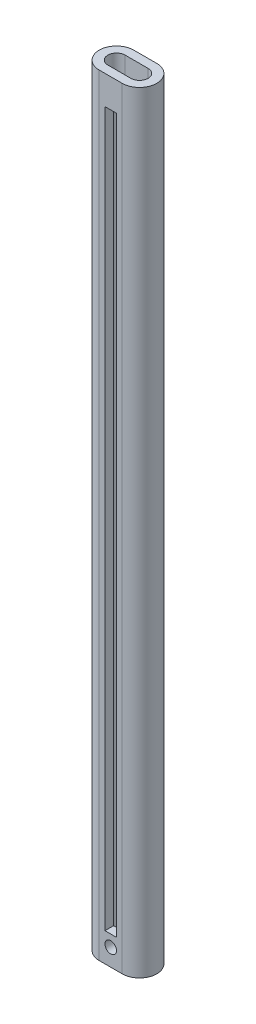
ISO-10303-21;
HEADER;
FILE_DESCRIPTION(('STEP AP214'),'2;1');
FILE_NAME('part.step','',(''),(''),'','','');
FILE_SCHEMA(('AUTOMOTIVE_DESIGN { 1 0 10303 214 1 1 1 1 }'));
ENDSEC;
DATA;
#1=APPLICATION_CONTEXT('core data for automotive mechanical design processes');
#2=APPLICATION_PROTOCOL_DEFINITION('international standard','automotive_design',2000,#1);
#3=PRODUCT_CONTEXT('',#1,'mechanical');
#4=PRODUCT('Part','Part','',(#3));
#5=PRODUCT_RELATED_PRODUCT_CATEGORY('part','',(#4));
#6=PRODUCT_DEFINITION_FORMATION('','',#4);
#7=PRODUCT_DEFINITION_CONTEXT('part definition',#1,'design');
#8=PRODUCT_DEFINITION('design','',#6,#7);
#9=PRODUCT_DEFINITION_SHAPE('','',#8);
#10=(LENGTH_UNIT() NAMED_UNIT(*) SI_UNIT(.MILLI.,.METRE.));
#11=(NAMED_UNIT(*) PLANE_ANGLE_UNIT() SI_UNIT($,.RADIAN.));
#12=(NAMED_UNIT(*) SI_UNIT($,.STERADIAN.) SOLID_ANGLE_UNIT());
#13=UNCERTAINTY_MEASURE_WITH_UNIT(LENGTH_MEASURE(1.E-05),#10,'distance_accuracy_value','');
#14=(GEOMETRIC_REPRESENTATION_CONTEXT(3) GLOBAL_UNCERTAINTY_ASSIGNED_CONTEXT((#13)) GLOBAL_UNIT_ASSIGNED_CONTEXT((#10,
#11,#12)) REPRESENTATION_CONTEXT('',''));
#15=CARTESIAN_POINT('',(0.,0.,0.));
#16=DIRECTION('',(0.,0.,1.));
#17=DIRECTION('',(1.,0.,0.));
#18=AXIS2_PLACEMENT_3D('',#15,#16,#17);
#19=CARTESIAN_POINT('',(1.,-124.,0.));
#20=DIRECTION('',(1.,0.,0.));
#21=DIRECTION('',(0.,0.,-1.));
#22=AXIS2_PLACEMENT_3D('',#19,#20,#21);
#23=PLANE('',#22);
#24=DIRECTION('',(0.,0.,-1.));
#25=VECTOR('',#24,1.);
#26=CARTESIAN_POINT('',(1.,0.,0.));
#27=LINE('',#26,#25);
#28=CARTESIAN_POINT('',(1.,0.,3.));
#29=VERTEX_POINT('',#28);
#30=CARTESIAN_POINT('',(1.,0.,1.5));
#31=VERTEX_POINT('',#30);
#32=EDGE_CURVE('E203',#29,#31,#27,.T.);
#33=ORIENTED_EDGE('',*,*,#32,.T.);
#34=DIRECTION('',(0.,1.,0.));
#35=VECTOR('',#34,1.);
#36=CARTESIAN_POINT('',(1.,-124.,1.5));
#37=LINE('',#36,#35);
#38=CARTESIAN_POINT('',(1.,-124.,1.5));
#39=VERTEX_POINT('',#38);
#40=EDGE_CURVE('E48',#39,#31,#37,.T.);
#41=ORIENTED_EDGE('',*,*,#40,.F.);
#42=DIRECTION('',(0.,0.,-1.));
#43=VECTOR('',#42,1.);
#44=CARTESIAN_POINT('',(1.,-124.,0.));
#45=LINE('',#44,#43);
#46=CARTESIAN_POINT('',(1.,-124.,3.));
#47=VERTEX_POINT('',#46);
#48=EDGE_CURVE('E202',#47,#39,#45,.T.);
#49=ORIENTED_EDGE('',*,*,#48,.F.);
#50=DIRECTION('',(0.,1.,0.));
#51=VECTOR('',#50,1.);
#52=CARTESIAN_POINT('',(1.,-124.,3.));
#53=LINE('',#52,#51);
#54=EDGE_CURVE('E11',#47,#29,#53,.T.);
#55=ORIENTED_EDGE('',*,*,#54,.T.);
#56=EDGE_LOOP('',(#33,#41,#49,#55));
#57=FACE_BOUND('',#56,.T.);
#58=ADVANCED_FACE('F38',(#57),#23,.F.);
#59=CARTESIAN_POINT('',(0.,-124.,1.5));
#60=DIRECTION('',(0.,0.,-1.));
#61=DIRECTION('',(-1.,0.,0.));
#62=AXIS2_PLACEMENT_3D('',#59,#60,#61);
#63=PLANE('',#62);
#64=CARTESIAN_POINT('',(0.,-126.,1.5));
#65=DIRECTION('',(0.,0.,-1.));
#66=DIRECTION('',(-1.,0.,0.));
#67=AXIS2_PLACEMENT_3D('',#64,#65,#66);
#68=CIRCLE('',#67,1.);
#69=CARTESIAN_POINT('',(1.,-126.,1.5));
#70=VERTEX_POINT('',#69);
#71=EDGE_CURVE('E152',#70,#70,#68,.T.);
#72=ORIENTED_EDGE('',*,*,#71,.F.);
#73=EDGE_LOOP('',(#72));
#74=FACE_BOUND('',#73,.T.);
#75=DIRECTION('',(1.,0.,0.));
#76=VECTOR('',#75,1.);
#77=CARTESIAN_POINT('',(0.,-124.,1.5));
#78=LINE('',#77,#76);
#79=CARTESIAN_POINT('',(-1.,-124.,1.5));
#80=VERTEX_POINT('',#79);
#81=EDGE_CURVE('E55',#80,#39,#78,.T.);
#82=ORIENTED_EDGE('',*,*,#81,.T.);
#83=ORIENTED_EDGE('',*,*,#40,.T.);
#84=DIRECTION('',(-1.,0.,0.));
#85=VECTOR('',#84,1.);
#86=CARTESIAN_POINT('',(0.,0.,1.5));
#87=LINE('',#86,#85);
#88=CARTESIAN_POINT('',(-1.,0.,1.5));
#89=VERTEX_POINT('',#88);
#90=EDGE_CURVE('E169',#31,#89,#87,.T.);
#91=ORIENTED_EDGE('',*,*,#90,.T.);
#92=DIRECTION('',(0.,1.,0.));
#93=VECTOR('',#92,1.);
#94=CARTESIAN_POINT('',(-1.,-124.,1.5));
#95=LINE('',#94,#93);
#96=EDGE_CURVE('E218',#80,#89,#95,.T.);
#97=ORIENTED_EDGE('',*,*,#96,.F.);
#98=EDGE_LOOP('',(#82,#83,#91,#97));
#99=FACE_BOUND('',#98,.T.);
#100=DIRECTION('',(0.,1.,0.));
#101=VECTOR('',#100,1.);
#102=CARTESIAN_POINT('',(2.,-124.,1.5));
#103=LINE('',#102,#101);
#104=CARTESIAN_POINT('',(2.,-129.,1.5));
#105=VERTEX_POINT('',#104);
#106=CARTESIAN_POINT('',(2.,5.,1.5));
#107=VERTEX_POINT('',#106);
#108=EDGE_CURVE('E210',#105,#107,#103,.T.);
#109=ORIENTED_EDGE('',*,*,#108,.F.);
#110=DIRECTION('',(1.,0.,0.));
#111=VECTOR('',#110,1.);
#112=CARTESIAN_POINT('',(0.,-129.,1.5));
#113=LINE('',#112,#111);
#114=CARTESIAN_POINT('',(-2.,-129.,1.5));
#115=VERTEX_POINT('',#114);
#116=EDGE_CURVE('E166',#115,#105,#113,.T.);
#117=ORIENTED_EDGE('',*,*,#116,.F.);
#118=DIRECTION('',(0.,1.,0.));
#119=VECTOR('',#118,1.);
#120=CARTESIAN_POINT('',(-2.,-124.,1.5));
#121=LINE('',#120,#119);
#122=CARTESIAN_POINT('',(-2.,5.,1.5));
#123=VERTEX_POINT('',#122);
#124=EDGE_CURVE('E216',#115,#123,#121,.T.);
#125=ORIENTED_EDGE('',*,*,#124,.T.);
#126=DIRECTION('',(-1.,0.,0.));
#127=VECTOR('',#126,1.);
#128=CARTESIAN_POINT('',(0.,5.,1.5));
#129=LINE('',#128,#127);
#130=EDGE_CURVE('E172',#107,#123,#129,.T.);
#131=ORIENTED_EDGE('',*,*,#130,.F.);
#132=EDGE_LOOP('',(#109,#117,#125,#131));
#133=FACE_BOUND('',#132,.T.);
#134=ADVANCED_FACE('F246',(#74,#99,#133),#63,.T.);
#135=CARTESIAN_POINT('',(2.,-124.,0.));
#136=DIRECTION('',(0.,1.,0.));
#137=DIRECTION('',(0.,0.,1.));
#138=AXIS2_PLACEMENT_3D('',#135,#136,#137);
#139=CYLINDRICAL_SURFACE('',#138,1.5);
#140=ORIENTED_EDGE('',*,*,#108,.T.);
#141=CARTESIAN_POINT('',(2.,5.,0.));
#142=DIRECTION('',(0.,1.,0.));
#143=DIRECTION('',(0.,0.,1.));
#144=AXIS2_PLACEMENT_3D('',#141,#142,#143);
#145=CIRCLE('',#144,1.5);
#146=CARTESIAN_POINT('',(2.,5.,-1.5));
#147=VERTEX_POINT('',#146);
#148=EDGE_CURVE('E182',#147,#107,#145,.F.);
#149=ORIENTED_EDGE('',*,*,#148,.F.);
#150=DIRECTION('',(0.,1.,0.));
#151=VECTOR('',#150,1.);
#152=CARTESIAN_POINT('',(2.,-124.,-1.5));
#153=LINE('',#152,#151);
#154=CARTESIAN_POINT('',(2.,-129.,-1.5));
#155=VERTEX_POINT('',#154);
#156=EDGE_CURVE('E212',#155,#147,#153,.T.);
#157=ORIENTED_EDGE('',*,*,#156,.F.);
#158=CARTESIAN_POINT('',(2.,-129.,0.));
#159=DIRECTION('',(0.,-1.,0.));
#160=DIRECTION('',(0.,0.,-1.));
#161=AXIS2_PLACEMENT_3D('',#158,#159,#160);
#162=CIRCLE('',#161,1.5);
#163=EDGE_CURVE('E157',#105,#155,#162,.F.);
#164=ORIENTED_EDGE('',*,*,#163,.F.);
#165=EDGE_LOOP('',(#140,#149,#157,#164));
#166=FACE_BOUND('',#165,.T.);
#167=ADVANCED_FACE('F267',(#166),#139,.F.);
#168=CARTESIAN_POINT('',(0.,-124.,-1.5));
#169=DIRECTION('',(0.,0.,1.));
#170=DIRECTION('',(1.,0.,0.));
#171=AXIS2_PLACEMENT_3D('',#168,#169,#170);
#172=PLANE('',#171);
#173=CARTESIAN_POINT('',(0.,-126.,-1.5));
#174=DIRECTION('',(0.,0.,1.));
#175=DIRECTION('',(1.,0.,0.));
#176=AXIS2_PLACEMENT_3D('',#173,#174,#175);
#177=CIRCLE('',#176,1.);
#178=CARTESIAN_POINT('',(1.,-126.,-1.5));
#179=VERTEX_POINT('',#178);
#180=EDGE_CURVE('E298',#179,#179,#177,.T.);
#181=ORIENTED_EDGE('',*,*,#180,.F.);
#182=EDGE_LOOP('',(#181));
#183=FACE_BOUND('',#182,.T.);
#184=ORIENTED_EDGE('',*,*,#156,.T.);
#185=DIRECTION('',(1.,0.,0.));
#186=VECTOR('',#185,1.);
#187=CARTESIAN_POINT('',(0.,5.,-1.5));
#188=LINE('',#187,#186);
#189=CARTESIAN_POINT('',(-2.,5.,-1.5));
#190=VERTEX_POINT('',#189);
#191=EDGE_CURVE('E179',#190,#147,#188,.T.);
#192=ORIENTED_EDGE('',*,*,#191,.F.);
#193=DIRECTION('',(0.,1.,0.));
#194=VECTOR('',#193,1.);
#195=CARTESIAN_POINT('',(-2.,-124.,-1.5));
#196=LINE('',#195,#194);
#197=CARTESIAN_POINT('',(-2.,-129.,-1.5));
#198=VERTEX_POINT('',#197);
#199=EDGE_CURVE('E214',#198,#190,#196,.T.);
#200=ORIENTED_EDGE('',*,*,#199,.F.);
#201=DIRECTION('',(-1.,0.,0.));
#202=VECTOR('',#201,1.);
#203=CARTESIAN_POINT('',(0.,-129.,-1.5));
#204=LINE('',#203,#202);
#205=EDGE_CURVE('E160',#155,#198,#204,.T.);
#206=ORIENTED_EDGE('',*,*,#205,.F.);
#207=EDGE_LOOP('',(#184,#192,#200,#206));
#208=FACE_BOUND('',#207,.T.);
#209=ADVANCED_FACE('F274',(#183,#208),#172,.T.);
#210=CARTESIAN_POINT('',(-2.,-124.,0.));
#211=DIRECTION('',(0.,1.,0.));
#212=DIRECTION('',(0.,0.,1.));
#213=AXIS2_PLACEMENT_3D('',#210,#211,#212);
#214=CYLINDRICAL_SURFACE('',#213,1.5);
#215=ORIENTED_EDGE('',*,*,#199,.T.);
#216=CARTESIAN_POINT('',(-2.,5.,0.));
#217=DIRECTION('',(0.,1.,0.));
#218=DIRECTION('',(0.,0.,1.));
#219=AXIS2_PLACEMENT_3D('',#216,#217,#218);
#220=CIRCLE('',#219,1.5);
#221=EDGE_CURVE('E175',#123,#190,#220,.F.);
#222=ORIENTED_EDGE('',*,*,#221,.F.);
#223=ORIENTED_EDGE('',*,*,#124,.F.);
#224=CARTESIAN_POINT('',(-2.,-129.,0.));
#225=DIRECTION('',(0.,-1.,0.));
#226=DIRECTION('',(0.,0.,-1.));
#227=AXIS2_PLACEMENT_3D('',#224,#225,#226);
#228=CIRCLE('',#227,1.5);
#229=EDGE_CURVE('E163',#198,#115,#228,.F.);
#230=ORIENTED_EDGE('',*,*,#229,.F.);
#231=EDGE_LOOP('',(#215,#222,#223,#230));
#232=FACE_BOUND('',#231,.T.);
#233=ADVANCED_FACE('F278',(#232),#214,.F.);
#234=CARTESIAN_POINT('',(-1.,-124.,0.));
#235=DIRECTION('',(1.,0.,0.));
#236=DIRECTION('',(0.,0.,-1.));
#237=AXIS2_PLACEMENT_3D('',#234,#235,#236);
#238=PLANE('',#237);
#239=DIRECTION('',(0.,0.,-1.));
#240=VECTOR('',#239,1.);
#241=CARTESIAN_POINT('',(-1.,0.,0.));
#242=LINE('',#241,#240);
#243=CARTESIAN_POINT('',(-1.,0.,3.));
#244=VERTEX_POINT('',#243);
#245=EDGE_CURVE('E194',#244,#89,#242,.T.);
#246=ORIENTED_EDGE('',*,*,#245,.F.);
#247=DIRECTION('',(0.,1.,0.));
#248=VECTOR('',#247,1.);
#249=CARTESIAN_POINT('',(-1.,-124.,3.));
#250=LINE('',#249,#248);
#251=CARTESIAN_POINT('',(-1.,-124.,3.));
#252=VERTEX_POINT('',#251);
#253=EDGE_CURVE('E221',#252,#244,#250,.T.);
#254=ORIENTED_EDGE('',*,*,#253,.F.);
#255=DIRECTION('',(0.,0.,-1.));
#256=VECTOR('',#255,1.);
#257=CARTESIAN_POINT('',(-1.,-124.,0.));
#258=LINE('',#257,#256);
#259=EDGE_CURVE('E199',#252,#80,#258,.T.);
#260=ORIENTED_EDGE('',*,*,#259,.T.);
#261=ORIENTED_EDGE('',*,*,#96,.T.);
#262=EDGE_LOOP('',(#246,#254,#260,#261));
#263=FACE_BOUND('',#262,.T.);
#264=ADVANCED_FACE('F236',(#263),#238,.T.);
#265=CARTESIAN_POINT('',(0.,-124.,3.));
#266=DIRECTION('',(0.,0.,1.));
#267=DIRECTION('',(1.,0.,0.));
#268=AXIS2_PLACEMENT_3D('',#265,#266,#267);
#269=PLANE('',#268);
#270=CARTESIAN_POINT('',(0.,-126.,3.));
#271=DIRECTION('',(0.,0.,1.));
#272=DIRECTION('',(1.,0.,0.));
#273=AXIS2_PLACEMENT_3D('',#270,#271,#272);
#274=CIRCLE('',#273,1.);
#275=CARTESIAN_POINT('',(1.,-126.,3.));
#276=VERTEX_POINT('',#275);
#277=EDGE_CURVE('E295',#276,#276,#274,.T.);
#278=ORIENTED_EDGE('',*,*,#277,.F.);
#279=EDGE_LOOP('',(#278));
#280=FACE_BOUND('',#279,.T.);
#281=DIRECTION('',(-1.,0.,0.));
#282=VECTOR('',#281,1.);
#283=CARTESIAN_POINT('',(0.,-129.,3.));
#284=LINE('',#283,#282);
#285=CARTESIAN_POINT('',(2.,-129.,3.));
#286=VERTEX_POINT('',#285);
#287=CARTESIAN_POINT('',(-2.,-129.,3.));
#288=VERTEX_POINT('',#287);
#289=EDGE_CURVE('E141',#286,#288,#284,.T.);
#290=ORIENTED_EDGE('',*,*,#289,.F.);
#291=DIRECTION('',(0.,1.,0.));
#292=VECTOR('',#291,1.);
#293=CARTESIAN_POINT('',(2.,-124.,3.));
#294=LINE('',#293,#292);
#295=CARTESIAN_POINT('',(2.,5.,3.));
#296=VERTEX_POINT('',#295);
#297=EDGE_CURVE('E42',#286,#296,#294,.T.);
#298=ORIENTED_EDGE('',*,*,#297,.T.);
#299=DIRECTION('',(1.,0.,0.));
#300=VECTOR('',#299,1.);
#301=CARTESIAN_POINT('',(0.,5.,3.));
#302=LINE('',#301,#300);
#303=CARTESIAN_POINT('',(-2.,5.,3.));
#304=VERTEX_POINT('',#303);
#305=EDGE_CURVE('E188',#304,#296,#302,.T.);
#306=ORIENTED_EDGE('',*,*,#305,.F.);
#307=DIRECTION('',(0.,1.,0.));
#308=VECTOR('',#307,1.);
#309=CARTESIAN_POINT('',(-2.,-124.,3.));
#310=LINE('',#309,#308);
#311=EDGE_CURVE('E224',#288,#304,#310,.T.);
#312=ORIENTED_EDGE('',*,*,#311,.F.);
#313=EDGE_LOOP('',(#290,#298,#306,#312));
#314=FACE_BOUND('',#313,.T.);
#315=ORIENTED_EDGE('',*,*,#253,.T.);
#316=DIRECTION('',(1.,0.,0.));
#317=VECTOR('',#316,1.);
#318=CARTESIAN_POINT('',(0.,0.,3.));
#319=LINE('',#318,#317);
#320=EDGE_CURVE('E176',#244,#29,#319,.T.);
#321=ORIENTED_EDGE('',*,*,#320,.T.);
#322=ORIENTED_EDGE('',*,*,#54,.F.);
#323=DIRECTION('',(-1.,0.,0.));
#324=VECTOR('',#323,1.);
#325=CARTESIAN_POINT('',(0.,-124.,3.));
#326=LINE('',#325,#324);
#327=EDGE_CURVE('E149',#47,#252,#326,.T.);
#328=ORIENTED_EDGE('',*,*,#327,.T.);
#329=EDGE_LOOP('',(#315,#321,#322,#328));
#330=FACE_BOUND('',#329,.T.);
#331=ADVANCED_FACE('F233',(#280,#314,#330),#269,.T.);
#332=CARTESIAN_POINT('',(-2.,-124.,0.));
#333=DIRECTION('',(0.,1.,0.));
#334=DIRECTION('',(0.,0.,1.));
#335=AXIS2_PLACEMENT_3D('',#332,#333,#334);
#336=CYLINDRICAL_SURFACE('',#335,3.);
#337=ORIENTED_EDGE('',*,*,#311,.T.);
#338=CARTESIAN_POINT('',(-2.,5.,0.));
#339=DIRECTION('',(0.,1.,0.));
#340=DIRECTION('',(0.,0.,1.));
#341=AXIS2_PLACEMENT_3D('',#338,#339,#340);
#342=CIRCLE('',#341,3.);
#343=CARTESIAN_POINT('',(-2.,5.,-3.));
#344=VERTEX_POINT('',#343);
#345=EDGE_CURVE('E185',#344,#304,#342,.T.);
#346=ORIENTED_EDGE('',*,*,#345,.F.);
#347=DIRECTION('',(0.,1.,0.));
#348=VECTOR('',#347,1.);
#349=CARTESIAN_POINT('',(-2.,-124.,-3.));
#350=LINE('',#349,#348);
#351=CARTESIAN_POINT('',(-2.,-129.,-3.));
#352=VERTEX_POINT('',#351);
#353=EDGE_CURVE('E135',#352,#344,#350,.T.);
#354=ORIENTED_EDGE('',*,*,#353,.F.);
#355=CARTESIAN_POINT('',(-2.,-129.,0.));
#356=DIRECTION('',(0.,-1.,0.));
#357=DIRECTION('',(0.,0.,-1.));
#358=AXIS2_PLACEMENT_3D('',#355,#356,#357);
#359=CIRCLE('',#358,3.);
#360=EDGE_CURVE('E147',#288,#352,#359,.T.);
#361=ORIENTED_EDGE('',*,*,#360,.F.);
#362=EDGE_LOOP('',(#337,#346,#354,#361));
#363=FACE_BOUND('',#362,.T.);
#364=ADVANCED_FACE('F230',(#363),#336,.T.);
#365=CARTESIAN_POINT('',(0.,-124.,-3.));
#366=DIRECTION('',(0.,0.,1.));
#367=DIRECTION('',(1.,0.,0.));
#368=AXIS2_PLACEMENT_3D('',#365,#366,#367);
#369=PLANE('',#368);
#370=CARTESIAN_POINT('',(0.,-126.,-3.));
#371=DIRECTION('',(0.,0.,1.));
#372=DIRECTION('',(1.,0.,0.));
#373=AXIS2_PLACEMENT_3D('',#370,#371,#372);
#374=CIRCLE('',#373,1.);
#375=CARTESIAN_POINT('',(1.,-126.,-3.));
#376=VERTEX_POINT('',#375);
#377=EDGE_CURVE('E293',#376,#376,#374,.T.);
#378=ORIENTED_EDGE('',*,*,#377,.T.);
#379=EDGE_LOOP('',(#378));
#380=FACE_BOUND('',#379,.T.);
#381=ORIENTED_EDGE('',*,*,#353,.T.);
#382=DIRECTION('',(-1.,0.,0.));
#383=VECTOR('',#382,1.);
#384=CARTESIAN_POINT('',(0.,5.,-3.));
#385=LINE('',#384,#383);
#386=CARTESIAN_POINT('',(2.,5.,-3.));
#387=VERTEX_POINT('',#386);
#388=EDGE_CURVE('E131',#387,#344,#385,.T.);
#389=ORIENTED_EDGE('',*,*,#388,.F.);
#390=DIRECTION('',(0.,1.,0.));
#391=VECTOR('',#390,1.);
#392=CARTESIAN_POINT('',(2.,-124.,-3.));
#393=LINE('',#392,#391);
#394=CARTESIAN_POINT('',(2.,-129.,-3.));
#395=VERTEX_POINT('',#394);
#396=EDGE_CURVE('E125',#395,#387,#393,.T.);
#397=ORIENTED_EDGE('',*,*,#396,.F.);
#398=DIRECTION('',(1.,0.,0.));
#399=VECTOR('',#398,1.);
#400=CARTESIAN_POINT('',(0.,-129.,-3.));
#401=LINE('',#400,#399);
#402=EDGE_CURVE('E129',#352,#395,#401,.T.);
#403=ORIENTED_EDGE('',*,*,#402,.F.);
#404=EDGE_LOOP('',(#381,#389,#397,#403));
#405=FACE_BOUND('',#404,.T.);
#406=ADVANCED_FACE('F127',(#380,#405),#369,.F.);
#407=CARTESIAN_POINT('',(2.,-124.,0.));
#408=DIRECTION('',(0.,1.,0.));
#409=DIRECTION('',(0.,0.,1.));
#410=AXIS2_PLACEMENT_3D('',#407,#408,#409);
#411=CYLINDRICAL_SURFACE('',#410,3.);
#412=ORIENTED_EDGE('',*,*,#396,.T.);
#413=CARTESIAN_POINT('',(2.,5.,0.));
#414=DIRECTION('',(0.,1.,0.));
#415=DIRECTION('',(0.,0.,1.));
#416=AXIS2_PLACEMENT_3D('',#413,#414,#415);
#417=CIRCLE('',#416,3.);
#418=EDGE_CURVE('E191',#296,#387,#417,.T.);
#419=ORIENTED_EDGE('',*,*,#418,.F.);
#420=ORIENTED_EDGE('',*,*,#297,.F.);
#421=CARTESIAN_POINT('',(2.,-129.,0.));
#422=DIRECTION('',(0.,-1.,0.));
#423=DIRECTION('',(0.,0.,-1.));
#424=AXIS2_PLACEMENT_3D('',#421,#422,#423);
#425=CIRCLE('',#424,3.);
#426=EDGE_CURVE('E137',#395,#286,#425,.T.);
#427=ORIENTED_EDGE('',*,*,#426,.F.);
#428=EDGE_LOOP('',(#412,#419,#420,#427));
#429=FACE_BOUND('',#428,.T.);
#430=ADVANCED_FACE('F40',(#429),#411,.T.);
#431=CARTESIAN_POINT('',(0.,0.,0.));
#432=DIRECTION('',(0.,1.,0.));
#433=DIRECTION('',(0.,0.,1.));
#434=AXIS2_PLACEMENT_3D('',#431,#432,#433);
#435=PLANE('',#434);
#436=ORIENTED_EDGE('',*,*,#320,.F.);
#437=ORIENTED_EDGE('',*,*,#245,.T.);
#438=ORIENTED_EDGE('',*,*,#90,.F.);
#439=ORIENTED_EDGE('',*,*,#32,.F.);
#440=EDGE_LOOP('',(#436,#437,#438,#439));
#441=FACE_BOUND('',#440,.T.);
#442=ADVANCED_FACE('F244',(#441),#435,.F.);
#443=CARTESIAN_POINT('',(0.,5.,0.));
#444=DIRECTION('',(0.,1.,0.));
#445=DIRECTION('',(0.,0.,1.));
#446=AXIS2_PLACEMENT_3D('',#443,#444,#445);
#447=PLANE('',#446);
#448=ORIENTED_EDGE('',*,*,#130,.T.);
#449=ORIENTED_EDGE('',*,*,#221,.T.);
#450=ORIENTED_EDGE('',*,*,#191,.T.);
#451=ORIENTED_EDGE('',*,*,#148,.T.);
#452=EDGE_LOOP('',(#448,#449,#450,#451));
#453=FACE_BOUND('',#452,.T.);
#454=ORIENTED_EDGE('',*,*,#345,.T.);
#455=ORIENTED_EDGE('',*,*,#305,.T.);
#456=ORIENTED_EDGE('',*,*,#418,.T.);
#457=ORIENTED_EDGE('',*,*,#388,.T.);
#458=EDGE_LOOP('',(#454,#455,#456,#457));
#459=FACE_BOUND('',#458,.T.);
#460=ADVANCED_FACE('F229',(#453,#459),#447,.T.);
#461=CARTESIAN_POINT('',(0.,-124.,0.));
#462=DIRECTION('',(0.,-1.,0.));
#463=DIRECTION('',(0.,0.,-1.));
#464=AXIS2_PLACEMENT_3D('',#461,#462,#463);
#465=PLANE('',#464);
#466=ORIENTED_EDGE('',*,*,#327,.F.);
#467=ORIENTED_EDGE('',*,*,#48,.T.);
#468=ORIENTED_EDGE('',*,*,#81,.F.);
#469=ORIENTED_EDGE('',*,*,#259,.F.);
#470=EDGE_LOOP('',(#466,#467,#468,#469));
#471=FACE_BOUND('',#470,.T.);
#472=ADVANCED_FACE('F251',(#471),#465,.F.);
#473=CARTESIAN_POINT('',(0.,-129.,0.));
#474=DIRECTION('',(0.,-1.,0.));
#475=DIRECTION('',(0.,0.,-1.));
#476=AXIS2_PLACEMENT_3D('',#473,#474,#475);
#477=PLANE('',#476);
#478=ORIENTED_EDGE('',*,*,#402,.T.);
#479=ORIENTED_EDGE('',*,*,#426,.T.);
#480=ORIENTED_EDGE('',*,*,#289,.T.);
#481=ORIENTED_EDGE('',*,*,#360,.T.);
#482=EDGE_LOOP('',(#478,#479,#480,#481));
#483=FACE_BOUND('',#482,.T.);
#484=ORIENTED_EDGE('',*,*,#163,.T.);
#485=ORIENTED_EDGE('',*,*,#205,.T.);
#486=ORIENTED_EDGE('',*,*,#229,.T.);
#487=ORIENTED_EDGE('',*,*,#116,.T.);
#488=EDGE_LOOP('',(#484,#485,#486,#487));
#489=FACE_BOUND('',#488,.T.);
#490=ADVANCED_FACE('F144',(#483,#489),#477,.T.);
#491=CARTESIAN_POINT('',(0.,-126.,-3.));
#492=DIRECTION('',(0.,0.,1.));
#493=DIRECTION('',(1.,0.,0.));
#494=AXIS2_PLACEMENT_3D('',#491,#492,#493);
#495=CYLINDRICAL_SURFACE('',#494,1.);
#496=CARTESIAN_POINT('',(1.,-126.,-1.5));
#497=CARTESIAN_POINT('',(1.,-126.,-1.515625));
#498=CARTESIAN_POINT('',(1.,-126.,-1.53125));
#499=CARTESIAN_POINT('',(1.,-126.,-1.5625));
#500=CARTESIAN_POINT('',(1.,-126.,-1.578125));
#501=CARTESIAN_POINT('',(1.,-126.,-1.609375));
#502=CARTESIAN_POINT('',(1.,-126.,-1.625));
#503=CARTESIAN_POINT('',(1.,-126.,-1.65625));
#504=CARTESIAN_POINT('',(1.,-126.,-1.671875));
#505=CARTESIAN_POINT('',(1.,-126.,-1.703125));
#506=CARTESIAN_POINT('',(1.,-126.,-1.71875));
#507=CARTESIAN_POINT('',(1.,-126.,-1.75));
#508=CARTESIAN_POINT('',(1.,-126.,-1.765625));
#509=CARTESIAN_POINT('',(1.,-126.,-1.796875));
#510=CARTESIAN_POINT('',(1.,-126.,-1.8125));
#511=CARTESIAN_POINT('',(1.,-126.,-1.84375));
#512=CARTESIAN_POINT('',(1.,-126.,-1.859375));
#513=CARTESIAN_POINT('',(1.,-126.,-1.890625));
#514=CARTESIAN_POINT('',(1.,-126.,-1.90625));
#515=CARTESIAN_POINT('',(1.,-126.,-1.9375));
#516=CARTESIAN_POINT('',(1.,-126.,-1.953125));
#517=CARTESIAN_POINT('',(1.,-126.,-1.984375));
#518=CARTESIAN_POINT('',(1.,-126.,-2.));
#519=CARTESIAN_POINT('',(1.,-126.,-2.03125));
#520=CARTESIAN_POINT('',(1.,-126.,-2.046875));
#521=CARTESIAN_POINT('',(1.,-126.,-2.078125));
#522=CARTESIAN_POINT('',(1.,-126.,-2.09375));
#523=CARTESIAN_POINT('',(1.,-126.,-2.125));
#524=CARTESIAN_POINT('',(1.,-126.,-2.140625));
#525=CARTESIAN_POINT('',(1.,-126.,-2.171875));
#526=CARTESIAN_POINT('',(1.,-126.,-2.1875));
#527=CARTESIAN_POINT('',(1.,-126.,-2.21875));
#528=CARTESIAN_POINT('',(1.,-126.,-2.234375));
#529=CARTESIAN_POINT('',(1.,-126.,-2.265625));
#530=CARTESIAN_POINT('',(1.,-126.,-2.28125));
#531=CARTESIAN_POINT('',(1.,-126.,-2.3125));
#532=CARTESIAN_POINT('',(1.,-126.,-2.328125));
#533=CARTESIAN_POINT('',(1.,-126.,-2.359375));
#534=CARTESIAN_POINT('',(1.,-126.,-2.375));
#535=CARTESIAN_POINT('',(1.,-126.,-2.40625));
#536=CARTESIAN_POINT('',(1.,-126.,-2.421875));
#537=CARTESIAN_POINT('',(1.,-126.,-2.453125));
#538=CARTESIAN_POINT('',(1.,-126.,-2.46875));
#539=CARTESIAN_POINT('',(1.,-126.,-2.5));
#540=CARTESIAN_POINT('',(1.,-126.,-2.515625));
#541=CARTESIAN_POINT('',(1.,-126.,-2.546875));
#542=CARTESIAN_POINT('',(1.,-126.,-2.5625));
#543=CARTESIAN_POINT('',(1.,-126.,-2.59375));
#544=CARTESIAN_POINT('',(1.,-126.,-2.609375));
#545=CARTESIAN_POINT('',(1.,-126.,-2.640625));
#546=CARTESIAN_POINT('',(1.,-126.,-2.65625));
#547=CARTESIAN_POINT('',(1.,-126.,-2.6875));
#548=CARTESIAN_POINT('',(1.,-126.,-2.703125));
#549=CARTESIAN_POINT('',(1.,-126.,-2.734375));
#550=CARTESIAN_POINT('',(1.,-126.,-2.75));
#551=CARTESIAN_POINT('',(1.,-126.,-2.78125));
#552=CARTESIAN_POINT('',(1.,-126.,-2.796875));
#553=CARTESIAN_POINT('',(1.,-126.,-2.828125));
#554=CARTESIAN_POINT('',(1.,-126.,-2.84375));
#555=CARTESIAN_POINT('',(1.,-126.,-2.875));
#556=CARTESIAN_POINT('',(1.,-126.,-2.890625));
#557=CARTESIAN_POINT('',(1.,-126.,-2.921875));
#558=CARTESIAN_POINT('',(1.,-126.,-2.9375));
#559=CARTESIAN_POINT('',(1.,-126.,-2.96875));
#560=CARTESIAN_POINT('',(1.,-126.,-2.984375));
#561=CARTESIAN_POINT('',(1.,-126.,-3.));
#562=B_SPLINE_CURVE_WITH_KNOTS('',3,(#496,#497,#498,#499,#500,#501,#502,#503,#504,#505,#506,
#507,#508,#509,#510,#511,#512,#513,#514,#515,#516,#517,#518,#519,#520,#521,#522,#523,#524,#525,
#526,#527,#528,#529,#530,#531,#532,#533,#534,#535,#536,#537,#538,#539,#540,#541,#542,#543,#544,
#545,#546,#547,#548,#549,#550,#551,#552,#553,#554,#555,#556,#557,#558,#559,#560,#561),
.UNSPECIFIED.,.F.,.F.,(4,2,2,2,2,2,2,2,2,2,2,2,2,2,2,2,2,2,2,2,2,2,2,2,2,2,2,2,2,2,2,2,4),(0.,
0.046875,0.0937500000000001,0.140625,0.1875,0.234375,0.28125,0.328125,0.375,0.421875,0.46875,
0.515625,0.5625,0.609375,0.65625,0.703125,0.75,0.796875,0.84375,0.890625,0.9375,0.984375,
1.03125,1.078125,1.125,1.171875,1.21875,1.265625,1.3125,1.359375,1.40625,1.453125,1.5),.UNSPECIFIED.);
#563=EDGE_CURVE('BSEAM258',#179,#376,#562,.T.);
#564=ORIENTED_EDGE('',*,*,#180,.T.);
#565=ORIENTED_EDGE('',*,*,#377,.F.);
#566=ORIENTED_EDGE('',*,*,#563,.T.);
#567=ORIENTED_EDGE('',*,*,#563,.F.);
#568=EDGE_LOOP('',(#564,#566,#565,#567));
#569=FACE_BOUND('',#568,.T.);
#570=ADVANCED_FACE('F258',(#569),#495,.F.);
#571=CARTESIAN_POINT('',(1.,-126.,1.5));
#572=CARTESIAN_POINT('',(1.,-126.,1.515625));
#573=CARTESIAN_POINT('',(1.,-126.,1.53125));
#574=CARTESIAN_POINT('',(1.,-126.,1.5625));
#575=CARTESIAN_POINT('',(1.,-126.,1.578125));
#576=CARTESIAN_POINT('',(1.,-126.,1.609375));
#577=CARTESIAN_POINT('',(1.,-126.,1.625));
#578=CARTESIAN_POINT('',(1.,-126.,1.65625));
#579=CARTESIAN_POINT('',(1.,-126.,1.671875));
#580=CARTESIAN_POINT('',(1.,-126.,1.703125));
#581=CARTESIAN_POINT('',(1.,-126.,1.71875));
#582=CARTESIAN_POINT('',(1.,-126.,1.75));
#583=CARTESIAN_POINT('',(1.,-126.,1.765625));
#584=CARTESIAN_POINT('',(1.,-126.,1.796875));
#585=CARTESIAN_POINT('',(1.,-126.,1.8125));
#586=CARTESIAN_POINT('',(1.,-126.,1.84375));
#587=CARTESIAN_POINT('',(1.,-126.,1.859375));
#588=CARTESIAN_POINT('',(1.,-126.,1.890625));
#589=CARTESIAN_POINT('',(1.,-126.,1.90625));
#590=CARTESIAN_POINT('',(1.,-126.,1.9375));
#591=CARTESIAN_POINT('',(1.,-126.,1.953125));
#592=CARTESIAN_POINT('',(1.,-126.,1.984375));
#593=CARTESIAN_POINT('',(1.,-126.,2.));
#594=CARTESIAN_POINT('',(1.,-126.,2.03125));
#595=CARTESIAN_POINT('',(1.,-126.,2.046875));
#596=CARTESIAN_POINT('',(1.,-126.,2.078125));
#597=CARTESIAN_POINT('',(1.,-126.,2.09375));
#598=CARTESIAN_POINT('',(1.,-126.,2.125));
#599=CARTESIAN_POINT('',(1.,-126.,2.140625));
#600=CARTESIAN_POINT('',(1.,-126.,2.171875));
#601=CARTESIAN_POINT('',(1.,-126.,2.1875));
#602=CARTESIAN_POINT('',(1.,-126.,2.21875));
#603=CARTESIAN_POINT('',(1.,-126.,2.234375));
#604=CARTESIAN_POINT('',(1.,-126.,2.265625));
#605=CARTESIAN_POINT('',(1.,-126.,2.28125));
#606=CARTESIAN_POINT('',(1.,-126.,2.3125));
#607=CARTESIAN_POINT('',(1.,-126.,2.328125));
#608=CARTESIAN_POINT('',(1.,-126.,2.359375));
#609=CARTESIAN_POINT('',(1.,-126.,2.375));
#610=CARTESIAN_POINT('',(1.,-126.,2.40625));
#611=CARTESIAN_POINT('',(1.,-126.,2.421875));
#612=CARTESIAN_POINT('',(1.,-126.,2.453125));
#613=CARTESIAN_POINT('',(1.,-126.,2.46875));
#614=CARTESIAN_POINT('',(1.,-126.,2.5));
#615=CARTESIAN_POINT('',(1.,-126.,2.515625));
#616=CARTESIAN_POINT('',(1.,-126.,2.546875));
#617=CARTESIAN_POINT('',(1.,-126.,2.5625));
#618=CARTESIAN_POINT('',(1.,-126.,2.59375));
#619=CARTESIAN_POINT('',(1.,-126.,2.609375));
#620=CARTESIAN_POINT('',(1.,-126.,2.640625));
#621=CARTESIAN_POINT('',(1.,-126.,2.65625));
#622=CARTESIAN_POINT('',(1.,-126.,2.6875));
#623=CARTESIAN_POINT('',(1.,-126.,2.703125));
#624=CARTESIAN_POINT('',(1.,-126.,2.734375));
#625=CARTESIAN_POINT('',(1.,-126.,2.75));
#626=CARTESIAN_POINT('',(1.,-126.,2.78125));
#627=CARTESIAN_POINT('',(1.,-126.,2.796875));
#628=CARTESIAN_POINT('',(1.,-126.,2.828125));
#629=CARTESIAN_POINT('',(1.,-126.,2.84375));
#630=CARTESIAN_POINT('',(1.,-126.,2.875));
#631=CARTESIAN_POINT('',(1.,-126.,2.890625));
#632=CARTESIAN_POINT('',(1.,-126.,2.921875));
#633=CARTESIAN_POINT('',(1.,-126.,2.9375));
#634=CARTESIAN_POINT('',(1.,-126.,2.96875));
#635=CARTESIAN_POINT('',(1.,-126.,2.984375));
#636=CARTESIAN_POINT('',(1.,-126.,3.));
#637=B_SPLINE_CURVE_WITH_KNOTS('',3,(#571,#572,#573,#574,#575,#576,#577,#578,#579,#580,#581,
#582,#583,#584,#585,#586,#587,#588,#589,#590,#591,#592,#593,#594,#595,#596,#597,#598,#599,#600,
#601,#602,#603,#604,#605,#606,#607,#608,#609,#610,#611,#612,#613,#614,#615,#616,#617,#618,#619,
#620,#621,#622,#623,#624,#625,#626,#627,#628,#629,#630,#631,#632,#633,#634,#635,#636),
.UNSPECIFIED.,.F.,.F.,(4,2,2,2,2,2,2,2,2,2,2,2,2,2,2,2,2,2,2,2,2,2,2,2,2,2,2,2,2,2,2,2,4),(0.,
0.046875,0.0937500000000001,0.140625,0.1875,0.234375,0.28125,0.328125,0.375,0.421875,0.46875,
0.515625,0.5625,0.609375000000001,0.656250000000001,0.703125000000001,0.750000000000001,
0.796875000000001,0.843750000000001,0.890625000000001,0.937500000000001,0.984375000000001,
1.03125,1.078125,1.125,1.171875,1.21875,1.265625,1.3125,1.359375,1.40625,1.453125,1.5),.UNSPECIFIED.);
#638=EDGE_CURVE('BSEAM306',#70,#276,#637,.T.);
#639=ORIENTED_EDGE('',*,*,#71,.T.);
#640=ORIENTED_EDGE('',*,*,#277,.T.);
#641=ORIENTED_EDGE('',*,*,#638,.T.);
#642=ORIENTED_EDGE('',*,*,#638,.F.);
#643=EDGE_LOOP('',(#639,#641,#640,#642));
#644=FACE_BOUND('',#643,.T.);
#645=ADVANCED_FACE('F306',(#644),#495,.F.);
#646=CLOSED_SHELL('',(#58,#134,#167,#209,#233,#264,#331,#364,#406,#430,#442,#460,#472,#490,#570,#645));
#647=MANIFOLD_SOLID_BREP('B2',#646);
#648=ADVANCED_BREP_SHAPE_REPRESENTATION('',(#18,#647),#14);
#649=SHAPE_DEFINITION_REPRESENTATION(#9,#648);
ENDSEC;
END-ISO-10303-21;
